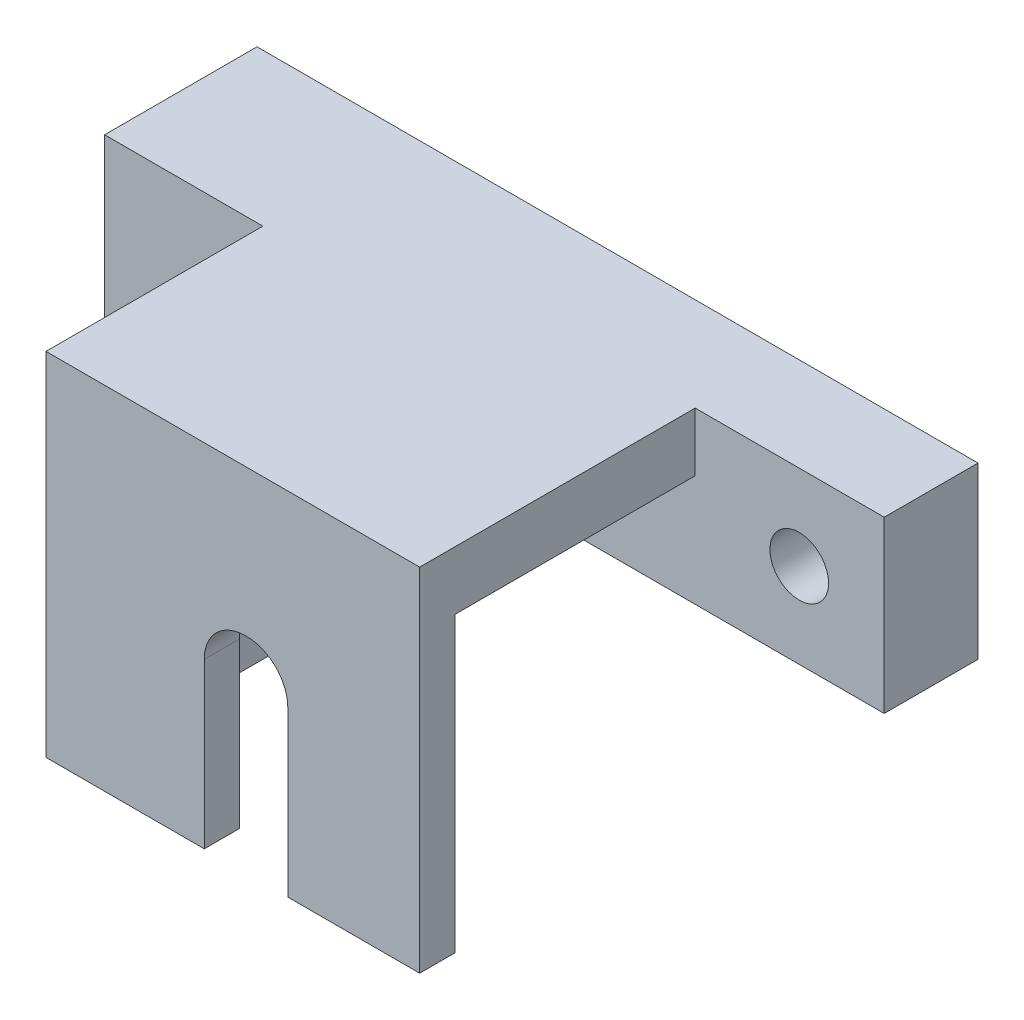
ISO-10303-21;
HEADER;
FILE_DESCRIPTION(('STEP AP214'),'2;1');
FILE_NAME('part.step','',(''),(''),'','','');
FILE_SCHEMA(('AUTOMOTIVE_DESIGN { 1 0 10303 214 1 1 1 1 }'));
ENDSEC;
DATA;
#1=APPLICATION_CONTEXT('core data for automotive mechanical design processes');
#2=APPLICATION_PROTOCOL_DEFINITION('international standard','automotive_design',2000,#1);
#3=PRODUCT_CONTEXT('',#1,'mechanical');
#4=PRODUCT('Part','Part','',(#3));
#5=PRODUCT_RELATED_PRODUCT_CATEGORY('part','',(#4));
#6=PRODUCT_DEFINITION_FORMATION('','',#4);
#7=PRODUCT_DEFINITION_CONTEXT('part definition',#1,'design');
#8=PRODUCT_DEFINITION('design','',#6,#7);
#9=PRODUCT_DEFINITION_SHAPE('','',#8);
#10=(LENGTH_UNIT() NAMED_UNIT(*) SI_UNIT(.MILLI.,.METRE.));
#11=(NAMED_UNIT(*) PLANE_ANGLE_UNIT() SI_UNIT($,.RADIAN.));
#12=(NAMED_UNIT(*) SI_UNIT($,.STERADIAN.) SOLID_ANGLE_UNIT());
#13=UNCERTAINTY_MEASURE_WITH_UNIT(LENGTH_MEASURE(1.E-05),#10,'distance_accuracy_value','');
#14=(GEOMETRIC_REPRESENTATION_CONTEXT(3) GLOBAL_UNCERTAINTY_ASSIGNED_CONTEXT((#13)) GLOBAL_UNIT_ASSIGNED_CONTEXT((#10,
#11,#12)) REPRESENTATION_CONTEXT('',''));
#15=CARTESIAN_POINT('',(0.,0.,0.));
#16=DIRECTION('',(0.,0.,1.));
#17=DIRECTION('',(1.,0.,0.));
#18=AXIS2_PLACEMENT_3D('',#15,#16,#17);
#19=CARTESIAN_POINT('',(0.,0.,3.2));
#20=DIRECTION('',(0.,0.,-1.));
#21=DIRECTION('',(-1.,0.,0.));
#22=AXIS2_PLACEMENT_3D('',#19,#20,#21);
#23=PLANE('',#22);
#24=CARTESIAN_POINT('',(21.7,2.9,3.2));
#25=DIRECTION('',(0.,0.,1.));
#26=DIRECTION('',(1.,0.,0.));
#27=AXIS2_PLACEMENT_3D('',#24,#25,#26);
#28=CIRCLE('',#27,1.);
#29=CARTESIAN_POINT('',(22.7,2.9,3.2));
#30=VERTEX_POINT('',#29);
#31=EDGE_CURVE('E275',#30,#30,#28,.T.);
#32=ORIENTED_EDGE('',*,*,#31,.F.);
#33=EDGE_LOOP('',(#32));
#34=FACE_BOUND('',#33,.T.);
#35=DIRECTION('',(0.,1.,0.));
#36=VECTOR('',#35,1.);
#37=CARTESIAN_POINT('',(18.15,3.8,3.2));
#38=LINE('',#37,#36);
#39=CARTESIAN_POINT('',(18.15,3.8,3.2));
#40=VERTEX_POINT('',#39);
#41=CARTESIAN_POINT('',(18.15,5.8,3.2));
#42=VERTEX_POINT('',#41);
#43=EDGE_CURVE('E187',#40,#42,#38,.T.);
#44=ORIENTED_EDGE('',*,*,#43,.F.);
#45=DIRECTION('',(1.,0.,0.));
#46=VECTOR('',#45,1.);
#47=CARTESIAN_POINT('',(6.2,3.8,3.2));
#48=LINE('',#47,#46);
#49=CARTESIAN_POINT('',(6.2,3.8,3.2));
#50=VERTEX_POINT('',#49);
#51=EDGE_CURVE('E223',#50,#40,#48,.T.);
#52=ORIENTED_EDGE('',*,*,#51,.F.);
#53=DIRECTION('',(0.,-1.,0.));
#54=VECTOR('',#53,1.);
#55=CARTESIAN_POINT('',(6.2,3.8,3.2));
#56=LINE('',#55,#54);
#57=CARTESIAN_POINT('',(6.2,0.,3.2));
#58=VERTEX_POINT('',#57);
#59=EDGE_CURVE('E179',#50,#58,#56,.T.);
#60=ORIENTED_EDGE('',*,*,#59,.T.);
#61=DIRECTION('',(1.,0.,0.));
#62=VECTOR('',#61,1.);
#63=CARTESIAN_POINT('',(0.,0.,3.2));
#64=LINE('',#63,#62);
#65=CARTESIAN_POINT('',(24.6,0.,3.2));
#66=VERTEX_POINT('',#65);
#67=EDGE_CURVE('E285',#58,#66,#64,.T.);
#68=ORIENTED_EDGE('',*,*,#67,.T.);
#69=DIRECTION('',(0.,1.,0.));
#70=VECTOR('',#69,1.);
#71=CARTESIAN_POINT('',(24.6,0.,3.2));
#72=LINE('',#71,#70);
#73=CARTESIAN_POINT('',(24.6,5.8,3.2));
#74=VERTEX_POINT('',#73);
#75=EDGE_CURVE('E284',#66,#74,#72,.T.);
#76=ORIENTED_EDGE('',*,*,#75,.T.);
#77=DIRECTION('',(-1.,0.,0.));
#78=VECTOR('',#77,1.);
#79=CARTESIAN_POINT('',(0.,5.8,3.2));
#80=LINE('',#79,#78);
#81=EDGE_CURVE('E287',#74,#42,#80,.T.);
#82=ORIENTED_EDGE('',*,*,#81,.T.);
#83=EDGE_LOOP('',(#44,#52,#60,#68,#76,#82));
#84=FACE_BOUND('',#83,.T.);
#85=ADVANCED_FACE('F38',(#34,#84),#23,.F.);
#86=CARTESIAN_POINT('',(10.8,5.8,11.4));
#87=DIRECTION('',(-1.,0.,0.));
#88=DIRECTION('',(0.,0.,1.));
#89=AXIS2_PLACEMENT_3D('',#86,#87,#88);
#90=PLANE('',#89);
#91=DIRECTION('',(0.,1.,0.));
#92=VECTOR('',#91,1.);
#93=CARTESIAN_POINT('',(10.8,-11.7317266743757,11.4));
#94=LINE('',#93,#92);
#95=CARTESIAN_POINT('',(10.8,-6.2,11.4));
#96=VERTEX_POINT('',#95);
#97=CARTESIAN_POINT('',(10.8,-0.6,11.4));
#98=VERTEX_POINT('',#97);
#99=EDGE_CURVE('E233',#96,#98,#94,.T.);
#100=ORIENTED_EDGE('',*,*,#99,.T.);
#101=DIRECTION('',(0.,0.,-1.));
#102=VECTOR('',#101,1.);
#103=CARTESIAN_POINT('',(10.8,-0.600000000000001,12.6));
#104=LINE('',#103,#102);
#105=CARTESIAN_POINT('',(10.8,-0.6,12.6));
#106=VERTEX_POINT('',#105);
#107=EDGE_CURVE('E59',#98,#106,#104,.F.);
#108=ORIENTED_EDGE('',*,*,#107,.T.);
#109=DIRECTION('',(0.,1.,0.));
#110=VECTOR('',#109,1.);
#111=CARTESIAN_POINT('',(10.8,-11.7317266743757,12.6));
#112=LINE('',#111,#110);
#113=CARTESIAN_POINT('',(10.8,-6.2,12.6));
#114=VERTEX_POINT('',#113);
#115=EDGE_CURVE('E237',#114,#106,#112,.T.);
#116=ORIENTED_EDGE('',*,*,#115,.F.);
#117=DIRECTION('',(0.,0.,1.));
#118=VECTOR('',#117,1.);
#119=CARTESIAN_POINT('',(10.8,-6.2,11.4));
#120=LINE('',#119,#118);
#121=EDGE_CURVE('E230',#96,#114,#120,.T.);
#122=ORIENTED_EDGE('',*,*,#121,.F.);
#123=EDGE_LOOP('',(#100,#108,#116,#122));
#124=FACE_BOUND('',#123,.T.);
#125=ADVANCED_FACE('F344',(#124),#90,.F.);
#126=CARTESIAN_POINT('',(6.2,5.8,5.2));
#127=DIRECTION('',(-1.,0.,0.));
#128=DIRECTION('',(0.,-1.,0.));
#129=AXIS2_PLACEMENT_3D('',#126,#127,#128);
#130=PLANE('',#129);
#131=DIRECTION('',(0.,1.,0.));
#132=VECTOR('',#131,1.);
#133=CARTESIAN_POINT('',(6.2,5.8,3.2));
#134=LINE('',#133,#132);
#135=CARTESIAN_POINT('',(6.2,-6.2,3.2));
#136=VERTEX_POINT('',#135);
#137=EDGE_CURVE('E259',#136,#58,#134,.T.);
#138=ORIENTED_EDGE('',*,*,#137,.T.);
#139=ORIENTED_EDGE('',*,*,#59,.F.);
#140=DIRECTION('',(0.,0.,-1.));
#141=VECTOR('',#140,1.);
#142=CARTESIAN_POINT('',(6.2,3.8,3.2));
#143=LINE('',#142,#141);
#144=CARTESIAN_POINT('',(6.2,3.8,11.4));
#145=VERTEX_POINT('',#144);
#146=EDGE_CURVE('E220',#145,#50,#143,.T.);
#147=ORIENTED_EDGE('',*,*,#146,.F.);
#148=DIRECTION('',(0.,1.,0.));
#149=VECTOR('',#148,1.);
#150=CARTESIAN_POINT('',(6.2,-6.2,11.4));
#151=LINE('',#150,#149);
#152=CARTESIAN_POINT('',(6.2,-6.2,11.4));
#153=VERTEX_POINT('',#152);
#154=EDGE_CURVE('E242',#153,#145,#151,.T.);
#155=ORIENTED_EDGE('',*,*,#154,.F.);
#156=DIRECTION('',(0.,0.,-1.));
#157=VECTOR('',#156,1.);
#158=CARTESIAN_POINT('',(6.2,-6.2,5.2));
#159=LINE('',#158,#157);
#160=EDGE_CURVE('E263',#153,#136,#159,.T.);
#161=ORIENTED_EDGE('',*,*,#160,.T.);
#162=EDGE_LOOP('',(#138,#139,#147,#155,#161));
#163=FACE_BOUND('',#162,.T.);
#164=ADVANCED_FACE('F352',(#163),#130,.F.);
#165=CARTESIAN_POINT('',(0.,0.,5.2));
#166=DIRECTION('',(0.,0.,1.));
#167=DIRECTION('',(1.,0.,0.));
#168=AXIS2_PLACEMENT_3D('',#165,#166,#167);
#169=PLANE('',#168);
#170=CARTESIAN_POINT('',(2.7,-3.1,5.2));
#171=DIRECTION('',(0.,0.,-1.));
#172=DIRECTION('',(-1.,0.,0.));
#173=AXIS2_PLACEMENT_3D('',#170,#171,#172);
#174=CIRCLE('',#173,1.);
#175=CARTESIAN_POINT('',(1.7,-3.1,5.2));
#176=VERTEX_POINT('',#175);
#177=EDGE_CURVE('E249',#176,#176,#174,.T.);
#178=ORIENTED_EDGE('',*,*,#177,.T.);
#179=EDGE_LOOP('',(#178));
#180=FACE_BOUND('',#179,.T.);
#181=DIRECTION('',(1.,0.,0.));
#182=VECTOR('',#181,1.);
#183=CARTESIAN_POINT('',(0.,-6.2,5.2));
#184=LINE('',#183,#182);
#185=CARTESIAN_POINT('',(0.,-6.2,5.2));
#186=VERTEX_POINT('',#185);
#187=CARTESIAN_POINT('',(5.4,-6.2,5.2));
#188=VERTEX_POINT('',#187);
#189=EDGE_CURVE('E258',#186,#188,#184,.T.);
#190=ORIENTED_EDGE('',*,*,#189,.T.);
#191=DIRECTION('',(0.,1.,0.));
#192=VECTOR('',#191,1.);
#193=CARTESIAN_POINT('',(5.4,0.,5.2));
#194=LINE('',#193,#192);
#195=CARTESIAN_POINT('',(5.4,5.8,5.2));
#196=VERTEX_POINT('',#195);
#197=EDGE_CURVE('E309',#188,#196,#194,.T.);
#198=ORIENTED_EDGE('',*,*,#197,.T.);
#199=DIRECTION('',(-1.,0.,0.));
#200=VECTOR('',#199,1.);
#201=CARTESIAN_POINT('',(0.,5.8,5.2));
#202=LINE('',#201,#200);
#203=CARTESIAN_POINT('',(0.,5.8,5.2));
#204=VERTEX_POINT('',#203);
#205=EDGE_CURVE('E261',#196,#204,#202,.T.);
#206=ORIENTED_EDGE('',*,*,#205,.T.);
#207=DIRECTION('',(0.,-1.,0.));
#208=VECTOR('',#207,1.);
#209=CARTESIAN_POINT('',(0.,5.8,5.2));
#210=LINE('',#209,#208);
#211=EDGE_CURVE('E255',#204,#186,#210,.T.);
#212=ORIENTED_EDGE('',*,*,#211,.T.);
#213=EDGE_LOOP('',(#190,#198,#206,#212));
#214=FACE_BOUND('',#213,.T.);
#215=ADVANCED_FACE('F387',(#180,#214),#169,.T.);
#216=CARTESIAN_POINT('',(0.,0.,0.));
#217=DIRECTION('',(0.,0.,-1.));
#218=DIRECTION('',(-1.,0.,0.));
#219=AXIS2_PLACEMENT_3D('',#216,#217,#218);
#220=PLANE('',#219);
#221=DIRECTION('',(0.,-1.,0.));
#222=VECTOR('',#221,1.);
#223=CARTESIAN_POINT('',(0.,0.,0.));
#224=LINE('',#223,#222);
#225=CARTESIAN_POINT('',(0.,5.8,0.));
#226=VERTEX_POINT('',#225);
#227=CARTESIAN_POINT('',(0.,0.,0.));
#228=VERTEX_POINT('',#227);
#229=EDGE_CURVE('E278',#226,#228,#224,.T.);
#230=ORIENTED_EDGE('',*,*,#229,.F.);
#231=DIRECTION('',(-1.,0.,0.));
#232=VECTOR('',#231,1.);
#233=CARTESIAN_POINT('',(0.,5.8,0.));
#234=LINE('',#233,#232);
#235=CARTESIAN_POINT('',(24.6,5.8,0.));
#236=VERTEX_POINT('',#235);
#237=EDGE_CURVE('E296',#236,#226,#234,.T.);
#238=ORIENTED_EDGE('',*,*,#237,.F.);
#239=DIRECTION('',(0.,1.,0.));
#240=VECTOR('',#239,1.);
#241=CARTESIAN_POINT('',(24.6,0.,0.));
#242=LINE('',#241,#240);
#243=CARTESIAN_POINT('',(24.6,0.,0.));
#244=VERTEX_POINT('',#243);
#245=EDGE_CURVE('E294',#244,#236,#242,.T.);
#246=ORIENTED_EDGE('',*,*,#245,.F.);
#247=DIRECTION('',(1.,0.,0.));
#248=VECTOR('',#247,1.);
#249=CARTESIAN_POINT('',(0.,0.,0.));
#250=LINE('',#249,#248);
#251=EDGE_CURVE('E292',#228,#244,#250,.T.);
#252=ORIENTED_EDGE('',*,*,#251,.F.);
#253=EDGE_LOOP('',(#230,#238,#246,#252));
#254=FACE_BOUND('',#253,.T.);
#255=CARTESIAN_POINT('',(21.7,2.9,0.));
#256=DIRECTION('',(0.,0.,1.));
#257=DIRECTION('',(1.,0.,0.));
#258=AXIS2_PLACEMENT_3D('',#255,#256,#257);
#259=CIRCLE('',#258,1.);
#260=CARTESIAN_POINT('',(22.7,2.9,0.));
#261=VERTEX_POINT('',#260);
#262=EDGE_CURVE('E274',#261,#261,#259,.T.);
#263=ORIENTED_EDGE('',*,*,#262,.T.);
#264=EDGE_LOOP('',(#263));
#265=FACE_BOUND('',#264,.T.);
#266=ADVANCED_FACE('F383',(#254,#265),#220,.T.);
#267=CARTESIAN_POINT('',(0.,0.,3.2));
#268=DIRECTION('',(1.,0.,0.));
#269=DIRECTION('',(0.,0.,-1.));
#270=AXIS2_PLACEMENT_3D('',#267,#268,#269);
#271=PLANE('',#270);
#272=ORIENTED_EDGE('',*,*,#229,.T.);
#273=DIRECTION('',(0.,0.,-1.));
#274=VECTOR('',#273,1.);
#275=CARTESIAN_POINT('',(0.,0.,3.2));
#276=LINE('',#275,#274);
#277=CARTESIAN_POINT('',(0.,0.,3.2));
#278=VERTEX_POINT('',#277);
#279=EDGE_CURVE('E306',#278,#228,#276,.T.);
#280=ORIENTED_EDGE('',*,*,#279,.F.);
#281=DIRECTION('',(0.,-1.,0.));
#282=VECTOR('',#281,1.);
#283=CARTESIAN_POINT('',(0.,5.8,3.2));
#284=LINE('',#283,#282);
#285=CARTESIAN_POINT('',(0.,-6.2,3.2));
#286=VERTEX_POINT('',#285);
#287=EDGE_CURVE('E252',#278,#286,#284,.T.);
#288=ORIENTED_EDGE('',*,*,#287,.T.);
#289=DIRECTION('',(0.,0.,-1.));
#290=VECTOR('',#289,1.);
#291=CARTESIAN_POINT('',(0.,-6.2,5.2));
#292=LINE('',#291,#290);
#293=EDGE_CURVE('E271',#186,#286,#292,.T.);
#294=ORIENTED_EDGE('',*,*,#293,.F.);
#295=ORIENTED_EDGE('',*,*,#211,.F.);
#296=DIRECTION('',(0.,0.,-1.));
#297=VECTOR('',#296,1.);
#298=CARTESIAN_POINT('',(0.,5.8,3.2));
#299=LINE('',#298,#297);
#300=EDGE_CURVE('E289',#204,#226,#299,.T.);
#301=ORIENTED_EDGE('',*,*,#300,.T.);
#302=EDGE_LOOP('',(#272,#280,#288,#294,#295,#301));
#303=FACE_BOUND('',#302,.T.);
#304=ADVANCED_FACE('F386',(#303),#271,.F.);
#305=CARTESIAN_POINT('',(0.,0.,3.2));
#306=DIRECTION('',(0.,1.,0.));
#307=DIRECTION('',(0.,0.,1.));
#308=AXIS2_PLACEMENT_3D('',#305,#306,#307);
#309=PLANE('',#308);
#310=ORIENTED_EDGE('',*,*,#67,.F.);
#311=EDGE_CURVE('E281',#278,#58,#64,.T.);
#312=ORIENTED_EDGE('',*,*,#311,.F.);
#313=ORIENTED_EDGE('',*,*,#279,.T.);
#314=ORIENTED_EDGE('',*,*,#251,.T.);
#315=DIRECTION('',(0.,0.,-1.));
#316=VECTOR('',#315,1.);
#317=CARTESIAN_POINT('',(24.6,0.,3.2));
#318=LINE('',#317,#316);
#319=EDGE_CURVE('E303',#66,#244,#318,.T.);
#320=ORIENTED_EDGE('',*,*,#319,.F.);
#321=EDGE_LOOP('',(#310,#312,#313,#314,#320));
#322=FACE_BOUND('',#321,.T.);
#323=ADVANCED_FACE('F394',(#322),#309,.F.);
#324=CARTESIAN_POINT('',(24.6,0.,3.2));
#325=DIRECTION('',(-1.,0.,0.));
#326=DIRECTION('',(0.,0.,1.));
#327=AXIS2_PLACEMENT_3D('',#324,#325,#326);
#328=PLANE('',#327);
#329=ORIENTED_EDGE('',*,*,#245,.T.);
#330=DIRECTION('',(0.,0.,-1.));
#331=VECTOR('',#330,1.);
#332=CARTESIAN_POINT('',(24.6,5.8,3.2));
#333=LINE('',#332,#331);
#334=EDGE_CURVE('E300',#74,#236,#333,.T.);
#335=ORIENTED_EDGE('',*,*,#334,.F.);
#336=ORIENTED_EDGE('',*,*,#75,.F.);
#337=ORIENTED_EDGE('',*,*,#319,.T.);
#338=EDGE_LOOP('',(#329,#335,#336,#337));
#339=FACE_BOUND('',#338,.T.);
#340=ADVANCED_FACE('F391',(#339),#328,.F.);
#341=CARTESIAN_POINT('',(0.,5.8,3.2));
#342=DIRECTION('',(0.,-1.,0.));
#343=DIRECTION('',(0.,0.,-1.));
#344=AXIS2_PLACEMENT_3D('',#341,#342,#343);
#345=PLANE('',#344);
#346=ORIENTED_EDGE('',*,*,#205,.F.);
#347=DIRECTION('',(0.,0.,-1.));
#348=VECTOR('',#347,1.);
#349=CARTESIAN_POINT('',(5.4,5.8,11.4));
#350=LINE('',#349,#348);
#351=CARTESIAN_POINT('',(5.4,5.8,12.6));
#352=VERTEX_POINT('',#351);
#353=EDGE_CURVE('E173',#352,#196,#350,.T.);
#354=ORIENTED_EDGE('',*,*,#353,.F.);
#355=DIRECTION('',(1.,0.,0.));
#356=VECTOR('',#355,1.);
#357=CARTESIAN_POINT('',(5.4,5.8,12.6));
#358=LINE('',#357,#356);
#359=CARTESIAN_POINT('',(18.15,5.8,12.6));
#360=VERTEX_POINT('',#359);
#361=EDGE_CURVE('E166',#352,#360,#358,.T.);
#362=ORIENTED_EDGE('',*,*,#361,.T.);
#363=DIRECTION('',(0.,0.,1.));
#364=VECTOR('',#363,1.);
#365=CARTESIAN_POINT('',(18.15,5.8,3.2));
#366=LINE('',#365,#364);
#367=EDGE_CURVE('E170',#42,#360,#366,.T.);
#368=ORIENTED_EDGE('',*,*,#367,.F.);
#369=ORIENTED_EDGE('',*,*,#81,.F.);
#370=ORIENTED_EDGE('',*,*,#334,.T.);
#371=ORIENTED_EDGE('',*,*,#237,.T.);
#372=ORIENTED_EDGE('',*,*,#300,.F.);
#373=EDGE_LOOP('',(#346,#354,#362,#368,#369,#370,#371,#372));
#374=FACE_BOUND('',#373,.T.);
#375=ADVANCED_FACE('F168',(#374),#345,.F.);
#376=CARTESIAN_POINT('',(21.7,2.9,3.2));
#377=DIRECTION('',(0.,0.,-1.));
#378=DIRECTION('',(-1.,0.,0.));
#379=AXIS2_PLACEMENT_3D('',#376,#377,#378);
#380=CYLINDRICAL_SURFACE('',#379,1.);
#381=ORIENTED_EDGE('',*,*,#31,.T.);
#382=EDGE_LOOP('',(#381));
#383=FACE_BOUND('',#382,.T.);
#384=ORIENTED_EDGE('',*,*,#262,.F.);
#385=EDGE_LOOP('',(#384));
#386=FACE_BOUND('',#385,.T.);
#387=ADVANCED_FACE('F381',(#383,#386),#380,.F.);
#388=CARTESIAN_POINT('',(0.,0.,3.2));
#389=DIRECTION('',(0.,0.,1.));
#390=DIRECTION('',(1.,0.,0.));
#391=AXIS2_PLACEMENT_3D('',#388,#389,#390);
#392=PLANE('',#391);
#393=ORIENTED_EDGE('',*,*,#137,.F.);
#394=DIRECTION('',(1.,0.,0.));
#395=VECTOR('',#394,1.);
#396=CARTESIAN_POINT('',(0.,-6.2,3.2));
#397=LINE('',#396,#395);
#398=EDGE_CURVE('E265',#286,#136,#397,.T.);
#399=ORIENTED_EDGE('',*,*,#398,.F.);
#400=ORIENTED_EDGE('',*,*,#287,.F.);
#401=ORIENTED_EDGE('',*,*,#311,.T.);
#402=EDGE_LOOP('',(#393,#399,#400,#401));
#403=FACE_BOUND('',#402,.T.);
#404=CARTESIAN_POINT('',(2.7,-3.1,3.2));
#405=DIRECTION('',(0.,0.,-1.));
#406=DIRECTION('',(-1.,0.,0.));
#407=AXIS2_PLACEMENT_3D('',#404,#405,#406);
#408=CIRCLE('',#407,1.);
#409=CARTESIAN_POINT('',(1.7,-3.1,3.2));
#410=VERTEX_POINT('',#409);
#411=EDGE_CURVE('E248',#410,#410,#408,.T.);
#412=ORIENTED_EDGE('',*,*,#411,.F.);
#413=EDGE_LOOP('',(#412));
#414=FACE_BOUND('',#413,.T.);
#415=ADVANCED_FACE('F495',(#403,#414),#392,.F.);
#416=CARTESIAN_POINT('',(0.,-6.2,5.2));
#417=DIRECTION('',(0.,1.,0.));
#418=DIRECTION('',(0.,0.,1.));
#419=AXIS2_PLACEMENT_3D('',#416,#417,#418);
#420=PLANE('',#419);
#421=ORIENTED_EDGE('',*,*,#160,.F.);
#422=DIRECTION('',(1.,0.,0.));
#423=VECTOR('',#422,1.);
#424=CARTESIAN_POINT('',(5.4,-6.2,11.4));
#425=LINE('',#424,#423);
#426=EDGE_CURVE('E232',#153,#96,#425,.T.);
#427=ORIENTED_EDGE('',*,*,#426,.T.);
#428=ORIENTED_EDGE('',*,*,#121,.T.);
#429=DIRECTION('',(-1.,0.,0.));
#430=VECTOR('',#429,1.);
#431=CARTESIAN_POINT('',(5.4,-6.2,12.6));
#432=LINE('',#431,#430);
#433=CARTESIAN_POINT('',(5.4,-6.2,12.6));
#434=VERTEX_POINT('',#433);
#435=EDGE_CURVE('E234',#114,#434,#432,.T.);
#436=ORIENTED_EDGE('',*,*,#435,.T.);
#437=DIRECTION('',(0.,0.,-1.));
#438=VECTOR('',#437,1.);
#439=CARTESIAN_POINT('',(5.4,-6.2,11.4));
#440=LINE('',#439,#438);
#441=EDGE_CURVE('E244',#434,#188,#440,.T.);
#442=ORIENTED_EDGE('',*,*,#441,.T.);
#443=ORIENTED_EDGE('',*,*,#189,.F.);
#444=ORIENTED_EDGE('',*,*,#293,.T.);
#445=ORIENTED_EDGE('',*,*,#398,.T.);
#446=EDGE_LOOP('',(#421,#427,#428,#436,#442,#443,#444,#445));
#447=FACE_BOUND('',#446,.T.);
#448=ADVANCED_FACE('F348',(#447),#420,.F.);
#449=CARTESIAN_POINT('',(2.7,-3.1,5.2));
#450=DIRECTION('',(0.,0.,-1.));
#451=DIRECTION('',(-1.,0.,0.));
#452=AXIS2_PLACEMENT_3D('',#449,#450,#451);
#453=CYLINDRICAL_SURFACE('',#452,1.);
#454=ORIENTED_EDGE('',*,*,#177,.F.);
#455=EDGE_LOOP('',(#454));
#456=FACE_BOUND('',#455,.T.);
#457=ORIENTED_EDGE('',*,*,#411,.T.);
#458=EDGE_LOOP('',(#457));
#459=FACE_BOUND('',#458,.T.);
#460=ADVANCED_FACE('F531',(#456,#459),#453,.F.);
#461=CARTESIAN_POINT('',(5.4,-6.2,11.4));
#462=DIRECTION('',(1.,0.,0.));
#463=DIRECTION('',(0.,0.,-1.));
#464=AXIS2_PLACEMENT_3D('',#461,#462,#463);
#465=PLANE('',#464);
#466=ORIENTED_EDGE('',*,*,#197,.F.);
#467=ORIENTED_EDGE('',*,*,#441,.F.);
#468=DIRECTION('',(0.,1.,0.));
#469=VECTOR('',#468,1.);
#470=CARTESIAN_POINT('',(5.4,-11.7317266743757,12.6));
#471=LINE('',#470,#469);
#472=EDGE_CURVE('E178',#434,#352,#471,.T.);
#473=ORIENTED_EDGE('',*,*,#472,.T.);
#474=ORIENTED_EDGE('',*,*,#353,.T.);
#475=EDGE_LOOP('',(#466,#467,#473,#474));
#476=FACE_BOUND('',#475,.T.);
#477=ADVANCED_FACE('F452',(#476),#465,.F.);
#478=CARTESIAN_POINT('',(5.4,-11.7317266743757,11.4));
#479=DIRECTION('',(0.,0.,-1.));
#480=DIRECTION('',(-1.,0.,0.));
#481=AXIS2_PLACEMENT_3D('',#478,#479,#480);
#482=PLANE('',#481);
#483=ORIENTED_EDGE('',*,*,#426,.F.);
#484=ORIENTED_EDGE('',*,*,#154,.T.);
#485=DIRECTION('',(-1.,0.,0.));
#486=VECTOR('',#485,1.);
#487=CARTESIAN_POINT('',(6.2,3.8,11.4));
#488=LINE('',#487,#486);
#489=CARTESIAN_POINT('',(18.15,3.8,11.4));
#490=VERTEX_POINT('',#489);
#491=EDGE_CURVE('E225',#490,#145,#488,.T.);
#492=ORIENTED_EDGE('',*,*,#491,.F.);
#493=DIRECTION('',(0.,1.,0.));
#494=VECTOR('',#493,1.);
#495=CARTESIAN_POINT('',(18.15,-6.2,11.4));
#496=LINE('',#495,#494);
#497=CARTESIAN_POINT('',(18.15,-6.2,11.4));
#498=VERTEX_POINT('',#497);
#499=EDGE_CURVE('E196',#498,#490,#496,.T.);
#500=ORIENTED_EDGE('',*,*,#499,.F.);
#501=DIRECTION('',(-1.,0.,0.));
#502=VECTOR('',#501,1.);
#503=CARTESIAN_POINT('',(18.15,-6.2,11.4));
#504=LINE('',#503,#502);
#505=CARTESIAN_POINT('',(13.65,-6.2,11.4));
#506=VERTEX_POINT('',#505);
#507=EDGE_CURVE('E204',#498,#506,#504,.T.);
#508=ORIENTED_EDGE('',*,*,#507,.T.);
#509=DIRECTION('',(0.,1.,0.));
#510=VECTOR('',#509,1.);
#511=CARTESIAN_POINT('',(13.65,-6.2,11.4));
#512=LINE('',#511,#510);
#513=CARTESIAN_POINT('',(13.65,-0.600000000000001,11.4));
#514=VERTEX_POINT('',#513);
#515=EDGE_CURVE('E209',#506,#514,#512,.T.);
#516=ORIENTED_EDGE('',*,*,#515,.T.);
#517=CARTESIAN_POINT('',(12.25,-0.600000000000001,11.4));
#518=DIRECTION('',(0.,0.,-1.));
#519=DIRECTION('',(-1.,0.,0.));
#520=AXIS2_PLACEMENT_3D('',#517,#518,#519);
#521=CIRCLE('',#520,1.4);
#522=CARTESIAN_POINT('',(12.25,0.799999999999999,11.4));
#523=VERTEX_POINT('',#522);
#524=EDGE_CURVE('E321',#514,#523,#521,.F.);
#525=ORIENTED_EDGE('',*,*,#524,.T.);
#526=DIRECTION('',(-1.,0.,0.));
#527=VECTOR('',#526,1.);
#528=CARTESIAN_POINT('',(13.65,0.799999999999999,11.4));
#529=LINE('',#528,#527);
#530=CARTESIAN_POINT('',(12.2,0.799999999999999,11.4));
#531=VERTEX_POINT('',#530);
#532=EDGE_CURVE('E215',#523,#531,#529,.T.);
#533=ORIENTED_EDGE('',*,*,#532,.T.);
#534=CARTESIAN_POINT('',(12.2,-0.600000000000001,11.4));
#535=DIRECTION('',(0.,0.,-1.));
#536=DIRECTION('',(-1.,0.,0.));
#537=AXIS2_PLACEMENT_3D('',#534,#535,#536);
#538=CIRCLE('',#537,1.4);
#539=EDGE_CURVE('E46',#531,#98,#538,.F.);
#540=ORIENTED_EDGE('',*,*,#539,.T.);
#541=ORIENTED_EDGE('',*,*,#99,.F.);
#542=EDGE_LOOP('',(#483,#484,#492,#500,#508,#516,#525,#533,#540,#541));
#543=FACE_BOUND('',#542,.T.);
#544=ADVANCED_FACE('F337',(#543),#482,.T.);
#545=CARTESIAN_POINT('',(5.4,-11.7317266743757,12.6));
#546=DIRECTION('',(0.,0.,1.));
#547=DIRECTION('',(1.,0.,0.));
#548=AXIS2_PLACEMENT_3D('',#545,#546,#547);
#549=PLANE('',#548);
#550=ORIENTED_EDGE('',*,*,#435,.F.);
#551=ORIENTED_EDGE('',*,*,#115,.T.);
#552=CARTESIAN_POINT('',(12.2,-0.600000000000001,12.6));
#553=DIRECTION('',(0.,0.,1.));
#554=DIRECTION('',(1.,0.,0.));
#555=AXIS2_PLACEMENT_3D('',#552,#553,#554);
#556=CIRCLE('',#555,1.4);
#557=CARTESIAN_POINT('',(12.2,0.799999999999999,12.6));
#558=VERTEX_POINT('',#557);
#559=EDGE_CURVE('E11',#106,#558,#556,.F.);
#560=ORIENTED_EDGE('',*,*,#559,.T.);
#561=DIRECTION('',(-1.,0.,0.));
#562=VECTOR('',#561,1.);
#563=CARTESIAN_POINT('',(13.65,0.799999999999999,12.6));
#564=LINE('',#563,#562);
#565=CARTESIAN_POINT('',(12.25,0.799999999999999,12.6));
#566=VERTEX_POINT('',#565);
#567=EDGE_CURVE('E217',#566,#558,#564,.T.);
#568=ORIENTED_EDGE('',*,*,#567,.F.);
#569=CARTESIAN_POINT('',(12.25,-0.600000000000001,12.6));
#570=DIRECTION('',(0.,0.,1.));
#571=DIRECTION('',(1.,0.,0.));
#572=AXIS2_PLACEMENT_3D('',#569,#570,#571);
#573=CIRCLE('',#572,1.4);
#574=CARTESIAN_POINT('',(13.65,-0.600000000000001,12.6));
#575=VERTEX_POINT('',#574);
#576=EDGE_CURVE('E323',#566,#575,#573,.F.);
#577=ORIENTED_EDGE('',*,*,#576,.T.);
#578=DIRECTION('',(0.,-1.,0.));
#579=VECTOR('',#578,1.);
#580=CARTESIAN_POINT('',(13.65,5.8,12.6));
#581=LINE('',#580,#579);
#582=CARTESIAN_POINT('',(13.65,-6.2,12.6));
#583=VERTEX_POINT('',#582);
#584=EDGE_CURVE('E205',#575,#583,#581,.T.);
#585=ORIENTED_EDGE('',*,*,#584,.T.);
#586=DIRECTION('',(-1.,0.,0.));
#587=VECTOR('',#586,1.);
#588=CARTESIAN_POINT('',(18.15,-6.2,12.6));
#589=LINE('',#588,#587);
#590=CARTESIAN_POINT('',(18.15,-6.2,12.6));
#591=VERTEX_POINT('',#590);
#592=EDGE_CURVE('E192',#591,#583,#589,.T.);
#593=ORIENTED_EDGE('',*,*,#592,.F.);
#594=DIRECTION('',(0.,-1.,0.));
#595=VECTOR('',#594,1.);
#596=CARTESIAN_POINT('',(18.15,5.8,12.6));
#597=LINE('',#596,#595);
#598=EDGE_CURVE('E183',#360,#591,#597,.T.);
#599=ORIENTED_EDGE('',*,*,#598,.F.);
#600=ORIENTED_EDGE('',*,*,#361,.F.);
#601=ORIENTED_EDGE('',*,*,#472,.F.);
#602=EDGE_LOOP('',(#550,#551,#560,#568,#577,#585,#593,#599,#600,#601));
#603=FACE_BOUND('',#602,.T.);
#604=ADVANCED_FACE('F190',(#603),#549,.T.);
#605=CARTESIAN_POINT('',(0.,3.8,0.));
#606=DIRECTION('',(0.,1.,0.));
#607=DIRECTION('',(0.,0.,1.));
#608=AXIS2_PLACEMENT_3D('',#605,#606,#607);
#609=PLANE('',#608);
#610=ORIENTED_EDGE('',*,*,#146,.T.);
#611=ORIENTED_EDGE('',*,*,#51,.T.);
#612=DIRECTION('',(0.,0.,-1.));
#613=VECTOR('',#612,1.);
#614=CARTESIAN_POINT('',(18.15,3.8,11.4));
#615=LINE('',#614,#613);
#616=EDGE_CURVE('E202',#490,#40,#615,.T.);
#617=ORIENTED_EDGE('',*,*,#616,.F.);
#618=ORIENTED_EDGE('',*,*,#491,.T.);
#619=EDGE_LOOP('',(#610,#611,#617,#618));
#620=FACE_BOUND('',#619,.T.);
#621=ADVANCED_FACE('F356',(#620),#609,.F.);
#622=CARTESIAN_POINT('',(13.65,0.799999999999999,0.));
#623=DIRECTION('',(0.,1.,0.));
#624=DIRECTION('',(0.,0.,1.));
#625=AXIS2_PLACEMENT_3D('',#622,#623,#624);
#626=PLANE('',#625);
#627=ORIENTED_EDGE('',*,*,#532,.F.);
#628=DIRECTION('',(0.,0.,-1.));
#629=VECTOR('',#628,1.);
#630=CARTESIAN_POINT('',(12.25,0.799999999999999,12.6));
#631=LINE('',#630,#629);
#632=EDGE_CURVE('E318',#523,#566,#631,.F.);
#633=ORIENTED_EDGE('',*,*,#632,.T.);
#634=ORIENTED_EDGE('',*,*,#567,.T.);
#635=DIRECTION('',(0.,0.,-1.));
#636=VECTOR('',#635,1.);
#637=CARTESIAN_POINT('',(12.2,0.799999999999999,11.4));
#638=LINE('',#637,#636);
#639=EDGE_CURVE('E315',#558,#531,#638,.T.);
#640=ORIENTED_EDGE('',*,*,#639,.T.);
#641=EDGE_LOOP('',(#627,#633,#634,#640));
#642=FACE_BOUND('',#641,.T.);
#643=ADVANCED_FACE('F339',(#642),#626,.F.);
#644=CARTESIAN_POINT('',(13.65,0.,0.));
#645=DIRECTION('',(1.,0.,0.));
#646=DIRECTION('',(0.,0.,-1.));
#647=AXIS2_PLACEMENT_3D('',#644,#645,#646);
#648=PLANE('',#647);
#649=ORIENTED_EDGE('',*,*,#584,.F.);
#650=DIRECTION('',(0.,0.,-1.));
#651=VECTOR('',#650,1.);
#652=CARTESIAN_POINT('',(13.65,-0.600000000000001,11.4));
#653=LINE('',#652,#651);
#654=EDGE_CURVE('E312',#575,#514,#653,.T.);
#655=ORIENTED_EDGE('',*,*,#654,.T.);
#656=ORIENTED_EDGE('',*,*,#515,.F.);
#657=DIRECTION('',(0.,0.,-1.));
#658=VECTOR('',#657,1.);
#659=CARTESIAN_POINT('',(13.65,-6.2,12.6));
#660=LINE('',#659,#658);
#661=EDGE_CURVE('E207',#583,#506,#660,.T.);
#662=ORIENTED_EDGE('',*,*,#661,.F.);
#663=EDGE_LOOP('',(#649,#655,#656,#662));
#664=FACE_BOUND('',#663,.T.);
#665=ADVANCED_FACE('F332',(#664),#648,.F.);
#666=CARTESIAN_POINT('',(18.15,-6.2,12.6));
#667=DIRECTION('',(0.,1.,0.));
#668=DIRECTION('',(0.,0.,1.));
#669=AXIS2_PLACEMENT_3D('',#666,#667,#668);
#670=PLANE('',#669);
#671=ORIENTED_EDGE('',*,*,#661,.T.);
#672=ORIENTED_EDGE('',*,*,#507,.F.);
#673=DIRECTION('',(0.,0.,-1.));
#674=VECTOR('',#673,1.);
#675=CARTESIAN_POINT('',(18.15,-6.2,12.6));
#676=LINE('',#675,#674);
#677=EDGE_CURVE('E194',#591,#498,#676,.T.);
#678=ORIENTED_EDGE('',*,*,#677,.F.);
#679=ORIENTED_EDGE('',*,*,#592,.T.);
#680=EDGE_LOOP('',(#671,#672,#678,#679));
#681=FACE_BOUND('',#680,.T.);
#682=ADVANCED_FACE('F360',(#681),#670,.F.);
#683=CARTESIAN_POINT('',(18.15,0.,0.));
#684=DIRECTION('',(1.,0.,0.));
#685=DIRECTION('',(0.,0.,-1.));
#686=AXIS2_PLACEMENT_3D('',#683,#684,#685);
#687=PLANE('',#686);
#688=ORIENTED_EDGE('',*,*,#43,.T.);
#689=ORIENTED_EDGE('',*,*,#367,.T.);
#690=ORIENTED_EDGE('',*,*,#598,.T.);
#691=ORIENTED_EDGE('',*,*,#677,.T.);
#692=ORIENTED_EDGE('',*,*,#499,.T.);
#693=ORIENTED_EDGE('',*,*,#616,.T.);
#694=EDGE_LOOP('',(#688,#689,#690,#691,#692,#693));
#695=FACE_BOUND('',#694,.T.);
#696=ADVANCED_FACE('F182',(#695),#687,.T.);
#697=CARTESIAN_POINT('',(12.25,-0.600000000000001,0.));
#698=DIRECTION('',(0.,0.,1.));
#699=DIRECTION('',(1.,0.,0.));
#700=AXIS2_PLACEMENT_3D('',#697,#698,#699);
#701=CYLINDRICAL_SURFACE('',#700,1.4);
#702=ORIENTED_EDGE('',*,*,#576,.F.);
#703=ORIENTED_EDGE('',*,*,#632,.F.);
#704=ORIENTED_EDGE('',*,*,#524,.F.);
#705=ORIENTED_EDGE('',*,*,#654,.F.);
#706=EDGE_LOOP('',(#702,#703,#704,#705));
#707=FACE_BOUND('',#706,.T.);
#708=ADVANCED_FACE('F334',(#707),#701,.F.);
#709=CARTESIAN_POINT('',(12.2,-0.600000000000001,0.));
#710=DIRECTION('',(0.,0.,1.));
#711=DIRECTION('',(1.,0.,0.));
#712=AXIS2_PLACEMENT_3D('',#709,#710,#711);
#713=CYLINDRICAL_SURFACE('',#712,1.4);
#714=ORIENTED_EDGE('',*,*,#559,.F.);
#715=ORIENTED_EDGE('',*,*,#107,.F.);
#716=ORIENTED_EDGE('',*,*,#539,.F.);
#717=ORIENTED_EDGE('',*,*,#639,.F.);
#718=EDGE_LOOP('',(#714,#715,#716,#717));
#719=FACE_BOUND('',#718,.T.);
#720=ADVANCED_FACE('F40',(#719),#713,.F.);
#721=CLOSED_SHELL('',(#85,#125,#164,#215,#266,#304,#323,#340,#375,#387,#415,#448,#460,#477,#544,
#604,#621,#643,#665,#682,#696,#708,#720));
#722=MANIFOLD_SOLID_BREP('B2',#721);
#723=ADVANCED_BREP_SHAPE_REPRESENTATION('',(#18,#722),#14);
#724=SHAPE_DEFINITION_REPRESENTATION(#9,#723);
ENDSEC;
END-ISO-10303-21;
